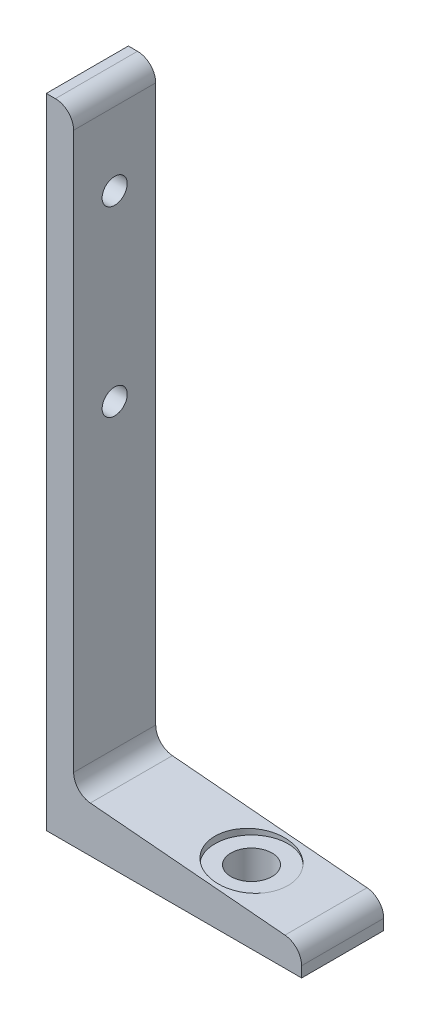
ISO-10303-21;
HEADER;
FILE_DESCRIPTION(('STEP AP214'),'2;1');
FILE_NAME('part.step','',(''),(''),'','','');
FILE_SCHEMA(('AUTOMOTIVE_DESIGN { 1 0 10303 214 1 1 1 1 }'));
ENDSEC;
DATA;
#1=APPLICATION_CONTEXT('core data for automotive mechanical design processes');
#2=APPLICATION_PROTOCOL_DEFINITION('international standard','automotive_design',2000,#1);
#3=PRODUCT_CONTEXT('',#1,'mechanical');
#4=PRODUCT('Part','Part','',(#3));
#5=PRODUCT_RELATED_PRODUCT_CATEGORY('part','',(#4));
#6=PRODUCT_DEFINITION_FORMATION('','',#4);
#7=PRODUCT_DEFINITION_CONTEXT('part definition',#1,'design');
#8=PRODUCT_DEFINITION('design','',#6,#7);
#9=PRODUCT_DEFINITION_SHAPE('','',#8);
#10=(LENGTH_UNIT() NAMED_UNIT(*) SI_UNIT(.MILLI.,.METRE.));
#11=(NAMED_UNIT(*) PLANE_ANGLE_UNIT() SI_UNIT($,.RADIAN.));
#12=(NAMED_UNIT(*) SI_UNIT($,.STERADIAN.) SOLID_ANGLE_UNIT());
#13=UNCERTAINTY_MEASURE_WITH_UNIT(LENGTH_MEASURE(1.E-05),#10,'distance_accuracy_value','');
#14=(GEOMETRIC_REPRESENTATION_CONTEXT(3) GLOBAL_UNCERTAINTY_ASSIGNED_CONTEXT((#13)) GLOBAL_UNIT_ASSIGNED_CONTEXT((#10,
#11,#12)) REPRESENTATION_CONTEXT('',''));
#15=CARTESIAN_POINT('',(0.,0.,0.));
#16=DIRECTION('',(0.,0.,1.));
#17=DIRECTION('',(1.,0.,0.));
#18=AXIS2_PLACEMENT_3D('',#15,#16,#17);
#19=CARTESIAN_POINT('',(6.,136.,9.));
#20=DIRECTION('',(-1.,0.,0.));
#21=DIRECTION('',(0.,-1.,0.));
#22=AXIS2_PLACEMENT_3D('',#19,#20,#21);
#23=PLANE('',#22);
#24=CARTESIAN_POINT('',(6.00000000000001,80.,0.));
#25=DIRECTION('',(-1.,0.,0.));
#26=DIRECTION('',(0.,-1.,0.));
#27=AXIS2_PLACEMENT_3D('',#24,#25,#26);
#28=CIRCLE('',#27,2.75);
#29=CARTESIAN_POINT('',(6.00000000000001,77.25,0.));
#30=VERTEX_POINT('',#29);
#31=EDGE_CURVE('E190',#30,#30,#28,.F.);
#32=ORIENTED_EDGE('',*,*,#31,.F.);
#33=EDGE_LOOP('',(#32));
#34=FACE_BOUND('',#33,.T.);
#35=DIRECTION('',(0.,1.,0.));
#36=VECTOR('',#35,1.);
#37=CARTESIAN_POINT('',(6.,136.,-9.));
#38=LINE('',#37,#36);
#39=CARTESIAN_POINT('',(6.00000000000002,14.0397578723656,-9.));
#40=VERTEX_POINT('',#39);
#41=CARTESIAN_POINT('',(6.,136.,-9.));
#42=VERTEX_POINT('',#41);
#43=EDGE_CURVE('E164',#40,#42,#38,.T.);
#44=ORIENTED_EDGE('',*,*,#43,.T.);
#45=DIRECTION('',(0.,0.,-1.));
#46=VECTOR('',#45,1.);
#47=CARTESIAN_POINT('',(6.,136.,9.));
#48=LINE('',#47,#46);
#49=CARTESIAN_POINT('',(6.,136.,9.));
#50=VERTEX_POINT('',#49);
#51=EDGE_CURVE('E143',#50,#42,#48,.T.);
#52=ORIENTED_EDGE('',*,*,#51,.F.);
#53=DIRECTION('',(0.,1.,0.));
#54=VECTOR('',#53,1.);
#55=CARTESIAN_POINT('',(6.,136.,9.));
#56=LINE('',#55,#54);
#57=CARTESIAN_POINT('',(6.00000000000002,14.0397578723656,9.));
#58=VERTEX_POINT('',#57);
#59=EDGE_CURVE('E134',#58,#50,#56,.T.);
#60=ORIENTED_EDGE('',*,*,#59,.F.);
#61=DIRECTION('',(0.,0.,-1.));
#62=VECTOR('',#61,1.);
#63=CARTESIAN_POINT('',(6.00000000000002,14.0397578723656,9.));
#64=LINE('',#63,#62);
#65=EDGE_CURVE('E173',#58,#40,#64,.T.);
#66=ORIENTED_EDGE('',*,*,#65,.T.);
#67=EDGE_LOOP('',(#44,#52,#60,#66));
#68=FACE_BOUND('',#67,.T.);
#69=CARTESIAN_POINT('',(6.,120.,0.));
#70=DIRECTION('',(-1.,0.,0.));
#71=DIRECTION('',(0.,-1.,0.));
#72=AXIS2_PLACEMENT_3D('',#69,#70,#71);
#73=CIRCLE('',#72,2.75);
#74=CARTESIAN_POINT('',(6.,117.25,0.));
#75=VERTEX_POINT('',#74);
#76=EDGE_CURVE('E236',#75,#75,#73,.F.);
#77=ORIENTED_EDGE('',*,*,#76,.F.);
#78=EDGE_LOOP('',(#77));
#79=FACE_BOUND('',#78,.T.);
#80=ADVANCED_FACE('F47',(#34,#68,#79),#23,.F.);
#81=CARTESIAN_POINT('',(0.,0.,9.));
#82=DIRECTION('',(1.,0.,0.));
#83=DIRECTION('',(0.,1.,0.));
#84=AXIS2_PLACEMENT_3D('',#81,#82,#83);
#85=PLANE('',#84);
#86=CARTESIAN_POINT('',(0.,80.,0.));
#87=DIRECTION('',(1.,0.,0.));
#88=DIRECTION('',(0.,0.,-1.));
#89=AXIS2_PLACEMENT_3D('',#86,#87,#88);
#90=CIRCLE('',#89,2.75);
#91=CARTESIAN_POINT('',(0.,80.,-2.75));
#92=VERTEX_POINT('',#91);
#93=EDGE_CURVE('E195',#92,#92,#90,.T.);
#94=ORIENTED_EDGE('',*,*,#93,.T.);
#95=EDGE_LOOP('',(#94));
#96=FACE_BOUND('',#95,.T.);
#97=DIRECTION('',(0.,-1.,0.));
#98=VECTOR('',#97,1.);
#99=CARTESIAN_POINT('',(0.,0.,-9.));
#100=LINE('',#99,#98);
#101=CARTESIAN_POINT('',(0.,140.,-9.));
#102=VERTEX_POINT('',#101);
#103=CARTESIAN_POINT('',(0.,0.,-9.));
#104=VERTEX_POINT('',#103);
#105=EDGE_CURVE('E104',#102,#104,#100,.T.);
#106=ORIENTED_EDGE('',*,*,#105,.T.);
#107=DIRECTION('',(0.,0.,-1.));
#108=VECTOR('',#107,1.);
#109=CARTESIAN_POINT('',(0.,0.,9.));
#110=LINE('',#109,#108);
#111=CARTESIAN_POINT('',(0.,0.,9.));
#112=VERTEX_POINT('',#111);
#113=EDGE_CURVE('E148',#112,#104,#110,.T.);
#114=ORIENTED_EDGE('',*,*,#113,.F.);
#115=DIRECTION('',(0.,-1.,0.));
#116=VECTOR('',#115,1.);
#117=CARTESIAN_POINT('',(0.,0.,9.));
#118=LINE('',#117,#116);
#119=CARTESIAN_POINT('',(0.,140.,9.));
#120=VERTEX_POINT('',#119);
#121=EDGE_CURVE('E66',#120,#112,#118,.T.);
#122=ORIENTED_EDGE('',*,*,#121,.F.);
#123=DIRECTION('',(0.,0.,-1.));
#124=VECTOR('',#123,1.);
#125=CARTESIAN_POINT('',(0.,140.,9.));
#126=LINE('',#125,#124);
#127=EDGE_CURVE('E144',#120,#102,#126,.T.);
#128=ORIENTED_EDGE('',*,*,#127,.T.);
#129=EDGE_LOOP('',(#106,#114,#122,#128));
#130=FACE_BOUND('',#129,.T.);
#131=CARTESIAN_POINT('',(0.,120.,0.));
#132=DIRECTION('',(1.,0.,0.));
#133=DIRECTION('',(0.,0.,-1.));
#134=AXIS2_PLACEMENT_3D('',#131,#132,#133);
#135=CIRCLE('',#134,2.75);
#136=CARTESIAN_POINT('',(0.,120.,-2.75));
#137=VERTEX_POINT('',#136);
#138=EDGE_CURVE('E234',#137,#137,#135,.T.);
#139=ORIENTED_EDGE('',*,*,#138,.T.);
#140=EDGE_LOOP('',(#139));
#141=FACE_BOUND('',#140,.T.);
#142=ADVANCED_FACE('F226',(#96,#130,#141),#85,.F.);
#143=CARTESIAN_POINT('',(9.65137702900941,10.0549790799986,9.));
#144=DIRECTION('',(-0.0871557427476512,-0.996194698091746,0.));
#145=DIRECTION('',(0.996194698091746,-0.0871557427476512,0.));
#146=AXIS2_PLACEMENT_3D('',#143,#144,#145);
#147=PLANE('',#146);
#148=DIRECTION('',(-0.996194698091746,0.0871557427476512,0.));
#149=VECTOR('',#148,1.);
#150=CARTESIAN_POINT('',(9.65137702900941,10.0549790799986,-9.));
#151=LINE('',#150,#149);
#152=CARTESIAN_POINT('',(52.3486229709906,6.31945409629726,-9.));
#153=VERTEX_POINT('',#152);
#154=CARTESIAN_POINT('',(9.65137702900941,10.0549790799986,-9.));
#155=VERTEX_POINT('',#154);
#156=EDGE_CURVE('E160',#153,#155,#151,.T.);
#157=ORIENTED_EDGE('',*,*,#156,.T.);
#158=DIRECTION('',(0.,0.,-1.));
#159=VECTOR('',#158,1.);
#160=CARTESIAN_POINT('',(9.65137702900941,10.0549790799986,9.));
#161=LINE('',#160,#159);
#162=CARTESIAN_POINT('',(9.65137702900941,10.0549790799986,9.));
#163=VERTEX_POINT('',#162);
#164=EDGE_CURVE('E176',#163,#155,#161,.T.);
#165=ORIENTED_EDGE('',*,*,#164,.F.);
#166=DIRECTION('',(-0.996194698091746,0.0871557427476512,0.));
#167=VECTOR('',#166,1.);
#168=CARTESIAN_POINT('',(9.65137702900941,10.0549790799986,9.));
#169=LINE('',#168,#167);
#170=CARTESIAN_POINT('',(52.3486229709906,6.31945409629726,9.));
#171=VERTEX_POINT('',#170);
#172=EDGE_CURVE('E205',#171,#163,#169,.T.);
#173=ORIENTED_EDGE('',*,*,#172,.F.);
#174=DIRECTION('',(0.,0.,-1.));
#175=VECTOR('',#174,1.);
#176=CARTESIAN_POINT('',(52.3486229709906,6.31945409629726,9.));
#177=LINE('',#176,#175);
#178=EDGE_CURVE('E179',#171,#153,#177,.T.);
#179=ORIENTED_EDGE('',*,*,#178,.T.);
#180=EDGE_LOOP('',(#157,#165,#173,#179));
#181=FACE_BOUND('',#180,.T.);
#182=CARTESIAN_POINT('',(36.,7.74977327051834,0.));
#183=DIRECTION('',(-0.0871557427476512,-0.996194698091746,0.));
#184=DIRECTION('',(0.996194698091746,-0.0871557427476512,0.));
#185=AXIS2_PLACEMENT_3D('',#182,#183,#184);
#186=ELLIPSE('',#185,8.03055870034677,8.);
#187=CARTESIAN_POINT('',(44.,7.04986396231101,0.));
#188=VERTEX_POINT('',#187);
#189=EDGE_CURVE('E51',#188,#188,#186,.F.);
#190=ORIENTED_EDGE('',*,*,#189,.F.);
#191=EDGE_LOOP('',(#190));
#192=FACE_BOUND('',#191,.T.);
#193=ADVANCED_FACE('F229',(#181,#192),#147,.F.);
#194=CARTESIAN_POINT('',(36.,140.,0.));
#195=DIRECTION('',(0.,-1.,0.));
#196=DIRECTION('',(0.,0.,-1.));
#197=AXIS2_PLACEMENT_3D('',#194,#195,#196);
#198=CYLINDRICAL_SURFACE('',#197,4.5);
#199=CARTESIAN_POINT('',(36.,0.,0.));
#200=DIRECTION('',(0.,1.,0.));
#201=DIRECTION('',(0.,0.,1.));
#202=AXIS2_PLACEMENT_3D('',#199,#200,#201);
#203=CIRCLE('',#202,4.5);
#204=CARTESIAN_POINT('',(36.,0.,4.5));
#205=VERTEX_POINT('',#204);
#206=EDGE_CURVE('E156',#205,#205,#203,.T.);
#207=ORIENTED_EDGE('',*,*,#206,.F.);
#208=EDGE_LOOP('',(#207));
#209=FACE_BOUND('',#208,.T.);
#210=CARTESIAN_POINT('',(36.,7.00000000000001,0.));
#211=DIRECTION('',(0.,1.,0.));
#212=DIRECTION('',(0.,0.,1.));
#213=AXIS2_PLACEMENT_3D('',#210,#211,#212);
#214=CIRCLE('',#213,4.5);
#215=CARTESIAN_POINT('',(36.,7.00000000000001,4.5));
#216=VERTEX_POINT('',#215);
#217=EDGE_CURVE('E183',#216,#216,#214,.T.);
#218=ORIENTED_EDGE('',*,*,#217,.T.);
#219=EDGE_LOOP('',(#218));
#220=FACE_BOUND('',#219,.T.);
#221=ADVANCED_FACE('F263',(#209,#220),#198,.F.);
#222=CARTESIAN_POINT('',(56.,0.,9.));
#223=DIRECTION('',(0.,1.,0.));
#224=DIRECTION('',(-1.,0.,0.));
#225=AXIS2_PLACEMENT_3D('',#222,#223,#224);
#226=PLANE('',#225);
#227=DIRECTION('',(1.,0.,0.));
#228=VECTOR('',#227,1.);
#229=CARTESIAN_POINT('',(56.,0.,-9.));
#230=LINE('',#229,#228);
#231=CARTESIAN_POINT('',(56.,0.,-9.));
#232=VERTEX_POINT('',#231);
#233=EDGE_CURVE('E152',#104,#232,#230,.T.);
#234=ORIENTED_EDGE('',*,*,#233,.T.);
#235=DIRECTION('',(0.,0.,-1.));
#236=VECTOR('',#235,1.);
#237=CARTESIAN_POINT('',(56.,0.,9.));
#238=LINE('',#237,#236);
#239=CARTESIAN_POINT('',(56.,0.,9.));
#240=VERTEX_POINT('',#239);
#241=EDGE_CURVE('E14',#240,#232,#238,.T.);
#242=ORIENTED_EDGE('',*,*,#241,.F.);
#243=DIRECTION('',(1.,0.,0.));
#244=VECTOR('',#243,1.);
#245=CARTESIAN_POINT('',(56.,0.,9.));
#246=LINE('',#245,#244);
#247=EDGE_CURVE('E169',#112,#240,#246,.T.);
#248=ORIENTED_EDGE('',*,*,#247,.F.);
#249=ORIENTED_EDGE('',*,*,#113,.T.);
#250=EDGE_LOOP('',(#234,#242,#248,#249));
#251=FACE_BOUND('',#250,.T.);
#252=ORIENTED_EDGE('',*,*,#206,.T.);
#253=EDGE_LOOP('',(#252));
#254=FACE_BOUND('',#253,.T.);
#255=ADVANCED_FACE('F49',(#251,#254),#226,.F.);
#256=CARTESIAN_POINT('',(56.,2.33467530393028,9.));
#257=DIRECTION('',(-1.,0.,0.));
#258=DIRECTION('',(0.,0.,1.));
#259=AXIS2_PLACEMENT_3D('',#256,#257,#258);
#260=PLANE('',#259);
#261=DIRECTION('',(0.,1.,0.));
#262=VECTOR('',#261,1.);
#263=CARTESIAN_POINT('',(56.,2.33467530393028,-9.));
#264=LINE('',#263,#262);
#265=CARTESIAN_POINT('',(56.,2.33467530393028,-9.));
#266=VERTEX_POINT('',#265);
#267=EDGE_CURVE('E155',#232,#266,#264,.T.);
#268=ORIENTED_EDGE('',*,*,#267,.T.);
#269=DIRECTION('',(0.,0.,-1.));
#270=VECTOR('',#269,1.);
#271=CARTESIAN_POINT('',(56.,2.33467530393028,9.));
#272=LINE('',#271,#270);
#273=CARTESIAN_POINT('',(56.,2.33467530393028,9.));
#274=VERTEX_POINT('',#273);
#275=EDGE_CURVE('E57',#274,#266,#272,.T.);
#276=ORIENTED_EDGE('',*,*,#275,.F.);
#277=DIRECTION('',(0.,1.,0.));
#278=VECTOR('',#277,1.);
#279=CARTESIAN_POINT('',(56.,2.33467530393028,9.));
#280=LINE('',#279,#278);
#281=EDGE_CURVE('E112',#240,#274,#280,.T.);
#282=ORIENTED_EDGE('',*,*,#281,.F.);
#283=ORIENTED_EDGE('',*,*,#241,.T.);
#284=EDGE_LOOP('',(#268,#276,#282,#283));
#285=FACE_BOUND('',#284,.T.);
#286=ADVANCED_FACE('F266',(#285),#260,.F.);
#287=CARTESIAN_POINT('',(52.,2.33467530393028,9.));
#288=DIRECTION('',(0.,0.,-1.));
#289=DIRECTION('',(-1.,0.,0.));
#290=AXIS2_PLACEMENT_3D('',#287,#288,#289);
#291=CYLINDRICAL_SURFACE('',#290,4.);
#292=CARTESIAN_POINT('',(52.,2.33467530393028,-9.));
#293=DIRECTION('',(0.,0.,1.));
#294=DIRECTION('',(1.,0.,0.));
#295=AXIS2_PLACEMENT_3D('',#292,#293,#294);
#296=CIRCLE('',#295,4.);
#297=EDGE_CURVE('E158',#266,#153,#296,.T.);
#298=ORIENTED_EDGE('',*,*,#297,.T.);
#299=ORIENTED_EDGE('',*,*,#178,.F.);
#300=CARTESIAN_POINT('',(52.,2.33467530393028,9.));
#301=DIRECTION('',(0.,0.,1.));
#302=DIRECTION('',(1.,0.,0.));
#303=AXIS2_PLACEMENT_3D('',#300,#301,#302);
#304=CIRCLE('',#303,4.);
#305=EDGE_CURVE('E203',#274,#171,#304,.T.);
#306=ORIENTED_EDGE('',*,*,#305,.F.);
#307=ORIENTED_EDGE('',*,*,#275,.T.);
#308=EDGE_LOOP('',(#298,#299,#306,#307));
#309=FACE_BOUND('',#308,.T.);
#310=ADVANCED_FACE('F260',(#309),#291,.T.);
#311=CARTESIAN_POINT('',(10.,14.0397578723656,9.));
#312=DIRECTION('',(0.,0.,-1.));
#313=DIRECTION('',(-1.,0.,0.));
#314=AXIS2_PLACEMENT_3D('',#311,#312,#313);
#315=CYLINDRICAL_SURFACE('',#314,4.);
#316=CARTESIAN_POINT('',(10.,14.0397578723656,-9.));
#317=DIRECTION('',(0.,0.,-1.));
#318=DIRECTION('',(1.,0.,0.));
#319=AXIS2_PLACEMENT_3D('',#316,#317,#318);
#320=CIRCLE('',#319,4.);
#321=EDGE_CURVE('E162',#155,#40,#320,.T.);
#322=ORIENTED_EDGE('',*,*,#321,.T.);
#323=ORIENTED_EDGE('',*,*,#65,.F.);
#324=CARTESIAN_POINT('',(10.,14.0397578723656,9.));
#325=DIRECTION('',(0.,0.,-1.));
#326=DIRECTION('',(1.,0.,0.));
#327=AXIS2_PLACEMENT_3D('',#324,#325,#326);
#328=CIRCLE('',#327,4.);
#329=EDGE_CURVE('E207',#163,#58,#328,.T.);
#330=ORIENTED_EDGE('',*,*,#329,.F.);
#331=ORIENTED_EDGE('',*,*,#164,.T.);
#332=EDGE_LOOP('',(#322,#323,#330,#331));
#333=FACE_BOUND('',#332,.T.);
#334=ADVANCED_FACE('F213',(#333),#315,.F.);
#335=CARTESIAN_POINT('',(2.,136.,9.));
#336=DIRECTION('',(0.,0.,-1.));
#337=DIRECTION('',(-1.,0.,0.));
#338=AXIS2_PLACEMENT_3D('',#335,#336,#337);
#339=CYLINDRICAL_SURFACE('',#338,4.);
#340=CARTESIAN_POINT('',(2.,136.,-9.));
#341=DIRECTION('',(0.,0.,1.));
#342=DIRECTION('',(1.,0.,0.));
#343=AXIS2_PLACEMENT_3D('',#340,#341,#342);
#344=CIRCLE('',#343,4.);
#345=CARTESIAN_POINT('',(2.,140.,-9.));
#346=VERTEX_POINT('',#345);
#347=EDGE_CURVE('E142',#42,#346,#344,.T.);
#348=ORIENTED_EDGE('',*,*,#347,.T.);
#349=DIRECTION('',(0.,0.,-1.));
#350=VECTOR('',#349,1.);
#351=CARTESIAN_POINT('',(2.,140.,9.));
#352=LINE('',#351,#350);
#353=CARTESIAN_POINT('',(2.,140.,9.));
#354=VERTEX_POINT('',#353);
#355=EDGE_CURVE('E139',#354,#346,#352,.T.);
#356=ORIENTED_EDGE('',*,*,#355,.F.);
#357=CARTESIAN_POINT('',(2.,136.,9.));
#358=DIRECTION('',(0.,0.,1.));
#359=DIRECTION('',(1.,0.,0.));
#360=AXIS2_PLACEMENT_3D('',#357,#358,#359);
#361=CIRCLE('',#360,4.);
#362=EDGE_CURVE('E128',#50,#354,#361,.T.);
#363=ORIENTED_EDGE('',*,*,#362,.F.);
#364=ORIENTED_EDGE('',*,*,#51,.T.);
#365=EDGE_LOOP('',(#348,#356,#363,#364));
#366=FACE_BOUND('',#365,.T.);
#367=ADVANCED_FACE('F140',(#366),#339,.T.);
#368=CARTESIAN_POINT('',(0.,140.,9.));
#369=DIRECTION('',(0.,-1.,0.));
#370=DIRECTION('',(0.,0.,-1.));
#371=AXIS2_PLACEMENT_3D('',#368,#369,#370);
#372=PLANE('',#371);
#373=DIRECTION('',(-1.,0.,0.));
#374=VECTOR('',#373,1.);
#375=CARTESIAN_POINT('',(0.,140.,-9.));
#376=LINE('',#375,#374);
#377=EDGE_CURVE('E98',#346,#102,#376,.T.);
#378=ORIENTED_EDGE('',*,*,#377,.T.);
#379=ORIENTED_EDGE('',*,*,#127,.F.);
#380=DIRECTION('',(-1.,0.,0.));
#381=VECTOR('',#380,1.);
#382=CARTESIAN_POINT('',(0.,140.,9.));
#383=LINE('',#382,#381);
#384=EDGE_CURVE('E132',#354,#120,#383,.T.);
#385=ORIENTED_EDGE('',*,*,#384,.F.);
#386=ORIENTED_EDGE('',*,*,#355,.T.);
#387=EDGE_LOOP('',(#378,#379,#385,#386));
#388=FACE_BOUND('',#387,.T.);
#389=ADVANCED_FACE('F146',(#388),#372,.F.);
#390=CARTESIAN_POINT('',(2.,136.,9.));
#391=DIRECTION('',(0.,0.,1.));
#392=DIRECTION('',(1.,0.,0.));
#393=AXIS2_PLACEMENT_3D('',#390,#391,#392);
#394=PLANE('',#393);
#395=ORIENTED_EDGE('',*,*,#247,.T.);
#396=ORIENTED_EDGE('',*,*,#281,.T.);
#397=ORIENTED_EDGE('',*,*,#305,.T.);
#398=ORIENTED_EDGE('',*,*,#172,.T.);
#399=ORIENTED_EDGE('',*,*,#329,.T.);
#400=ORIENTED_EDGE('',*,*,#59,.T.);
#401=ORIENTED_EDGE('',*,*,#362,.T.);
#402=ORIENTED_EDGE('',*,*,#384,.T.);
#403=ORIENTED_EDGE('',*,*,#121,.T.);
#404=EDGE_LOOP('',(#395,#396,#397,#398,#399,#400,#401,#402,#403));
#405=FACE_BOUND('',#404,.T.);
#406=ADVANCED_FACE('F130',(#405),#394,.T.);
#407=CARTESIAN_POINT('',(2.,136.,-9.));
#408=DIRECTION('',(0.,0.,1.));
#409=DIRECTION('',(1.,0.,0.));
#410=AXIS2_PLACEMENT_3D('',#407,#408,#409);
#411=PLANE('',#410);
#412=ORIENTED_EDGE('',*,*,#233,.F.);
#413=ORIENTED_EDGE('',*,*,#105,.F.);
#414=ORIENTED_EDGE('',*,*,#377,.F.);
#415=ORIENTED_EDGE('',*,*,#347,.F.);
#416=ORIENTED_EDGE('',*,*,#43,.F.);
#417=ORIENTED_EDGE('',*,*,#321,.F.);
#418=ORIENTED_EDGE('',*,*,#156,.F.);
#419=ORIENTED_EDGE('',*,*,#297,.F.);
#420=ORIENTED_EDGE('',*,*,#267,.F.);
#421=EDGE_LOOP('',(#412,#413,#414,#415,#416,#417,#418,#419,#420));
#422=FACE_BOUND('',#421,.T.);
#423=ADVANCED_FACE('F220',(#422),#411,.F.);
#424=CARTESIAN_POINT('',(36.,140.,0.));
#425=DIRECTION('',(0.,-1.,0.));
#426=DIRECTION('',(0.,0.,-1.));
#427=AXIS2_PLACEMENT_3D('',#424,#425,#426);
#428=CYLINDRICAL_SURFACE('',#427,8.);
#429=CARTESIAN_POINT('',(36.,7.,0.));
#430=DIRECTION('',(0.,1.,0.));
#431=DIRECTION('',(0.,0.,1.));
#432=AXIS2_PLACEMENT_3D('',#429,#430,#431);
#433=CIRCLE('',#432,8.);
#434=CARTESIAN_POINT('',(36.,7.,8.));
#435=VERTEX_POINT('',#434);
#436=EDGE_CURVE('E185',#435,#435,#433,.T.);
#437=ORIENTED_EDGE('',*,*,#436,.F.);
#438=EDGE_LOOP('',(#437));
#439=FACE_BOUND('',#438,.T.);
#440=ORIENTED_EDGE('',*,*,#189,.T.);
#441=EDGE_LOOP('',(#440));
#442=FACE_BOUND('',#441,.T.);
#443=ADVANCED_FACE('F278',(#439,#442),#428,.F.);
#444=CARTESIAN_POINT('',(36.,7.,0.));
#445=DIRECTION('',(0.,1.,0.));
#446=DIRECTION('',(0.,0.,1.));
#447=AXIS2_PLACEMENT_3D('',#444,#445,#446);
#448=PLANE('',#447);
#449=ORIENTED_EDGE('',*,*,#217,.F.);
#450=EDGE_LOOP('',(#449));
#451=FACE_BOUND('',#450,.T.);
#452=ORIENTED_EDGE('',*,*,#436,.T.);
#453=EDGE_LOOP('',(#452));
#454=FACE_BOUND('',#453,.T.);
#455=ADVANCED_FACE('F247',(#451,#454),#448,.T.);
#456=CARTESIAN_POINT('',(56.,80.,0.));
#457=DIRECTION('',(-1.,0.,0.));
#458=DIRECTION('',(0.,0.,1.));
#459=AXIS2_PLACEMENT_3D('',#456,#457,#458);
#460=CYLINDRICAL_SURFACE('',#459,2.75);
#461=ORIENTED_EDGE('',*,*,#93,.F.);
#462=EDGE_LOOP('',(#461));
#463=FACE_BOUND('',#462,.T.);
#464=ORIENTED_EDGE('',*,*,#31,.T.);
#465=EDGE_LOOP('',(#464));
#466=FACE_BOUND('',#465,.T.);
#467=ADVANCED_FACE('F243',(#463,#466),#460,.F.);
#468=CARTESIAN_POINT('',(56.,120.,0.));
#469=DIRECTION('',(-1.,0.,0.));
#470=DIRECTION('',(0.,0.,1.));
#471=AXIS2_PLACEMENT_3D('',#468,#469,#470);
#472=CYLINDRICAL_SURFACE('',#471,2.75);
#473=ORIENTED_EDGE('',*,*,#138,.F.);
#474=EDGE_LOOP('',(#473));
#475=FACE_BOUND('',#474,.T.);
#476=ORIENTED_EDGE('',*,*,#76,.T.);
#477=EDGE_LOOP('',(#476));
#478=FACE_BOUND('',#477,.T.);
#479=ADVANCED_FACE('F246',(#475,#478),#472,.F.);
#480=CLOSED_SHELL('',(#80,#142,#193,#221,#255,#286,#310,#334,#367,#389,#406,#423,#443,#455,#467,#479));
#481=MANIFOLD_SOLID_BREP('B2',#480);
#482=ADVANCED_BREP_SHAPE_REPRESENTATION('',(#18,#481),#14);
#483=SHAPE_DEFINITION_REPRESENTATION(#9,#482);
ENDSEC;
END-ISO-10303-21;
